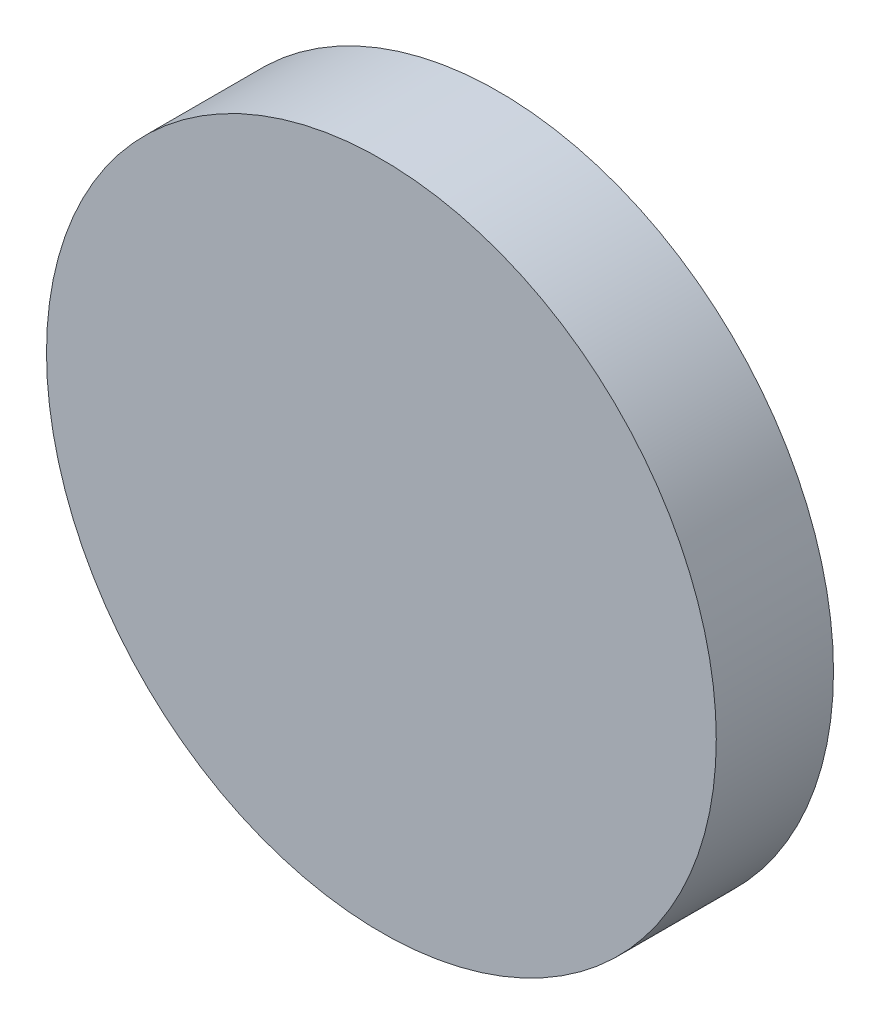
ISO-10303-21;
HEADER;
FILE_DESCRIPTION(('STEP AP214'),'2;1');
FILE_NAME('part.step','',(''),(''),'','','');
FILE_SCHEMA(('AUTOMOTIVE_DESIGN { 1 0 10303 214 1 1 1 1 }'));
ENDSEC;
DATA;
#1=APPLICATION_CONTEXT('core data for automotive mechanical design processes');
#2=APPLICATION_PROTOCOL_DEFINITION('international standard','automotive_design',2000,#1);
#3=PRODUCT_CONTEXT('',#1,'mechanical');
#4=PRODUCT('Part','Part','',(#3));
#5=PRODUCT_RELATED_PRODUCT_CATEGORY('part','',(#4));
#6=PRODUCT_DEFINITION_FORMATION('','',#4);
#7=PRODUCT_DEFINITION_CONTEXT('part definition',#1,'design');
#8=PRODUCT_DEFINITION('design','',#6,#7);
#9=PRODUCT_DEFINITION_SHAPE('','',#8);
#10=(LENGTH_UNIT() NAMED_UNIT(*) SI_UNIT(.MILLI.,.METRE.));
#11=(NAMED_UNIT(*) PLANE_ANGLE_UNIT() SI_UNIT($,.RADIAN.));
#12=(NAMED_UNIT(*) SI_UNIT($,.STERADIAN.) SOLID_ANGLE_UNIT());
#13=UNCERTAINTY_MEASURE_WITH_UNIT(LENGTH_MEASURE(1.E-05),#10,'distance_accuracy_value','');
#14=(GEOMETRIC_REPRESENTATION_CONTEXT(3) GLOBAL_UNCERTAINTY_ASSIGNED_CONTEXT((#13)) GLOBAL_UNIT_ASSIGNED_CONTEXT((#10,
#11,#12)) REPRESENTATION_CONTEXT('',''));
#15=CARTESIAN_POINT('',(0.,0.,0.));
#16=DIRECTION('',(0.,0.,1.));
#17=DIRECTION('',(1.,0.,0.));
#18=AXIS2_PLACEMENT_3D('',#15,#16,#17);
#19=CARTESIAN_POINT('',(0.,0.,7.));
#20=DIRECTION('',(0.,0.,-1.));
#21=DIRECTION('',(-1.,0.,0.));
#22=AXIS2_PLACEMENT_3D('',#19,#20,#21);
#23=CYLINDRICAL_SURFACE('',#22,20.);
#24=CARTESIAN_POINT('',(0.,0.,7.));
#25=DIRECTION('',(0.,0.,1.));
#26=DIRECTION('',(1.,0.,0.));
#27=AXIS2_PLACEMENT_3D('',#24,#25,#26);
#28=CIRCLE('',#27,20.);
#29=CARTESIAN_POINT('',(20.,0.,7.));
#30=VERTEX_POINT('',#29);
#31=EDGE_CURVE('E10',#30,#30,#28,.T.);
#32=ORIENTED_EDGE('',*,*,#31,.F.);
#33=EDGE_LOOP('',(#32));
#34=FACE_BOUND('',#33,.T.);
#35=CARTESIAN_POINT('',(0.,0.,0.));
#36=DIRECTION('',(0.,0.,1.));
#37=DIRECTION('',(1.,0.,0.));
#38=AXIS2_PLACEMENT_3D('',#35,#36,#37);
#39=CIRCLE('',#38,20.);
#40=CARTESIAN_POINT('',(20.,0.,0.));
#41=VERTEX_POINT('',#40);
#42=EDGE_CURVE('E40',#41,#41,#39,.T.);
#43=ORIENTED_EDGE('',*,*,#42,.T.);
#44=EDGE_LOOP('',(#43));
#45=FACE_BOUND('',#44,.T.);
#46=ADVANCED_FACE('F37',(#34,#45),#23,.T.);
#47=CARTESIAN_POINT('',(0.,0.,7.));
#48=DIRECTION('',(0.,0.,1.));
#49=DIRECTION('',(1.,0.,0.));
#50=AXIS2_PLACEMENT_3D('',#47,#48,#49);
#51=PLANE('',#50);
#52=ORIENTED_EDGE('',*,*,#31,.T.);
#53=EDGE_LOOP('',(#52));
#54=FACE_BOUND('',#53,.T.);
#55=ADVANCED_FACE('F54',(#54),#51,.T.);
#56=CARTESIAN_POINT('',(0.,0.,0.));
#57=DIRECTION('',(0.,0.,1.));
#58=DIRECTION('',(1.,0.,0.));
#59=AXIS2_PLACEMENT_3D('',#56,#57,#58);
#60=PLANE('',#59);
#61=ORIENTED_EDGE('',*,*,#42,.F.);
#62=EDGE_LOOP('',(#61));
#63=FACE_BOUND('',#62,.T.);
#64=ADVANCED_FACE('F52',(#63),#60,.F.);
#65=CLOSED_SHELL('',(#46,#55,#64));
#66=MANIFOLD_SOLID_BREP('B2',#65);
#67=ADVANCED_BREP_SHAPE_REPRESENTATION('',(#18,#66),#14);
#68=SHAPE_DEFINITION_REPRESENTATION(#9,#67);
ENDSEC;
END-ISO-10303-21;
